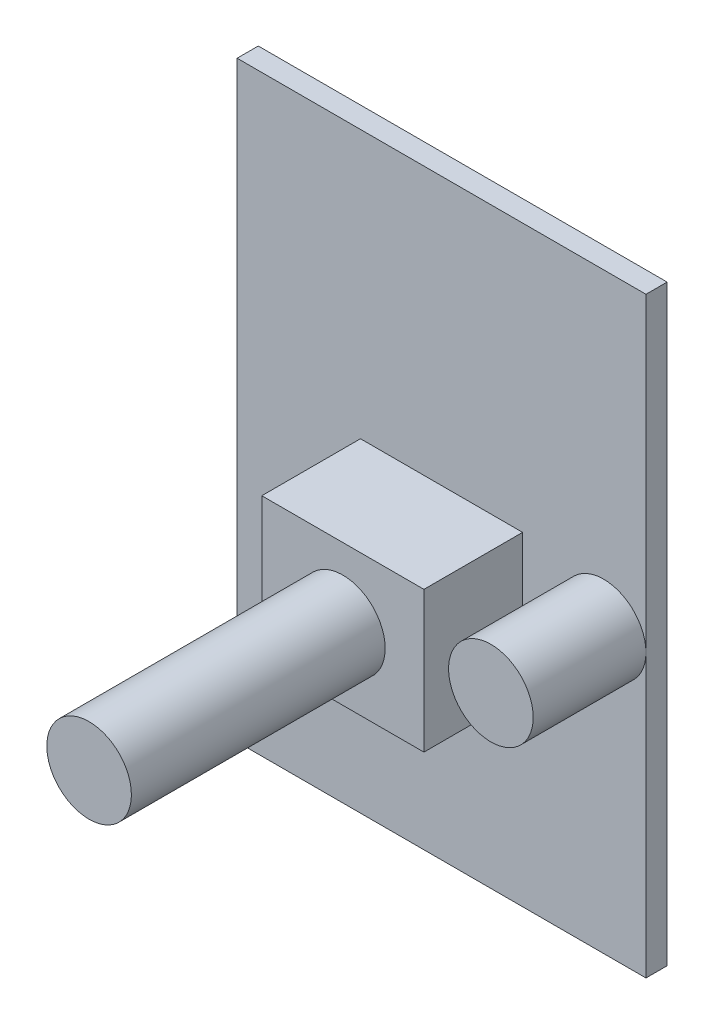
ISO-10303-21;
HEADER;
FILE_DESCRIPTION(('STEP AP214'),'2;1');
FILE_NAME('part.step','',(''),(''),'','','');
FILE_SCHEMA(('AUTOMOTIVE_DESIGN { 1 0 10303 214 1 1 1 1 }'));
ENDSEC;
DATA;
#1=APPLICATION_CONTEXT('core data for automotive mechanical design processes');
#2=APPLICATION_PROTOCOL_DEFINITION('international standard','automotive_design',2000,#1);
#3=PRODUCT_CONTEXT('',#1,'mechanical');
#4=PRODUCT('Part','Part','',(#3));
#5=PRODUCT_RELATED_PRODUCT_CATEGORY('part','',(#4));
#6=PRODUCT_DEFINITION_FORMATION('','',#4);
#7=PRODUCT_DEFINITION_CONTEXT('part definition',#1,'design');
#8=PRODUCT_DEFINITION('design','',#6,#7);
#9=PRODUCT_DEFINITION_SHAPE('','',#8);
#10=(LENGTH_UNIT() NAMED_UNIT(*) SI_UNIT(.MILLI.,.METRE.));
#11=(NAMED_UNIT(*) PLANE_ANGLE_UNIT() SI_UNIT($,.RADIAN.));
#12=(NAMED_UNIT(*) SI_UNIT($,.STERADIAN.) SOLID_ANGLE_UNIT());
#13=UNCERTAINTY_MEASURE_WITH_UNIT(LENGTH_MEASURE(1.E-05),#10,'distance_accuracy_value','');
#14=(GEOMETRIC_REPRESENTATION_CONTEXT(3) GLOBAL_UNCERTAINTY_ASSIGNED_CONTEXT((#13)) GLOBAL_UNIT_ASSIGNED_CONTEXT((#10,
#11,#12)) REPRESENTATION_CONTEXT('',''));
#15=CARTESIAN_POINT('',(0.,0.,0.));
#16=DIRECTION('',(0.,0.,1.));
#17=DIRECTION('',(1.,0.,0.));
#18=AXIS2_PLACEMENT_3D('',#15,#16,#17);
#19=CARTESIAN_POINT('',(0.,0.,1.5));
#20=DIRECTION('',(0.,0.,1.));
#21=DIRECTION('',(1.,0.,0.));
#22=AXIS2_PLACEMENT_3D('',#19,#20,#21);
#23=PLANE('',#22);
#24=DIRECTION('',(0.,1.,0.));
#25=VECTOR('',#24,1.);
#26=CARTESIAN_POINT('',(14.5,21.,1.5));
#27=LINE('',#26,#25);
#28=CARTESIAN_POINT('',(14.5,-21.,1.5));
#29=VERTEX_POINT('',#28);
#30=CARTESIAN_POINT('',(14.5,-0.999999999999994,1.5));
#31=VERTEX_POINT('',#30);
#32=EDGE_CURVE('E133',#29,#31,#27,.T.);
#33=ORIENTED_EDGE('',*,*,#32,.T.);
#34=CARTESIAN_POINT('',(11.5,-1.,1.5));
#35=DIRECTION('',(0.,0.,1.));
#36=DIRECTION('',(1.,0.,0.));
#37=AXIS2_PLACEMENT_3D('',#34,#35,#36);
#38=CIRCLE('',#37,3.);
#39=EDGE_CURVE('E46',#31,#31,#38,.T.);
#40=ORIENTED_EDGE('',*,*,#39,.F.);
#41=CARTESIAN_POINT('',(14.5,21.,1.5));
#42=VERTEX_POINT('',#41);
#43=EDGE_CURVE('E137',#31,#42,#27,.T.);
#44=ORIENTED_EDGE('',*,*,#43,.T.);
#45=DIRECTION('',(-1.,0.,0.));
#46=VECTOR('',#45,1.);
#47=CARTESIAN_POINT('',(-14.5,21.,1.5));
#48=LINE('',#47,#46);
#49=CARTESIAN_POINT('',(-14.5,21.,1.5));
#50=VERTEX_POINT('',#49);
#51=EDGE_CURVE('E136',#42,#50,#48,.T.);
#52=ORIENTED_EDGE('',*,*,#51,.T.);
#53=DIRECTION('',(0.,-1.,0.));
#54=VECTOR('',#53,1.);
#55=CARTESIAN_POINT('',(-14.5,21.,1.5));
#56=LINE('',#55,#54);
#57=CARTESIAN_POINT('',(-14.5,-21.,1.5));
#58=VERTEX_POINT('',#57);
#59=EDGE_CURVE('E139',#50,#58,#56,.T.);
#60=ORIENTED_EDGE('',*,*,#59,.T.);
#61=DIRECTION('',(1.,0.,0.));
#62=VECTOR('',#61,1.);
#63=CARTESIAN_POINT('',(-14.5,-21.,1.5));
#64=LINE('',#63,#62);
#65=EDGE_CURVE('E141',#58,#29,#64,.T.);
#66=ORIENTED_EDGE('',*,*,#65,.T.);
#67=EDGE_LOOP('',(#33,#40,#44,#52,#60,#66));
#68=FACE_BOUND('',#67,.T.);
#69=DIRECTION('',(-1.,0.,0.));
#70=VECTOR('',#69,1.);
#71=CARTESIAN_POINT('',(-5.75,2.,1.5));
#72=LINE('',#71,#70);
#73=CARTESIAN_POINT('',(5.75,2.,1.5));
#74=VERTEX_POINT('',#73);
#75=CARTESIAN_POINT('',(-5.75,2.,1.5));
#76=VERTEX_POINT('',#75);
#77=EDGE_CURVE('E323',#74,#76,#72,.T.);
#78=ORIENTED_EDGE('',*,*,#77,.F.);
#79=DIRECTION('',(0.,1.,0.));
#80=VECTOR('',#79,1.);
#81=CARTESIAN_POINT('',(5.75,2.,1.5));
#82=LINE('',#81,#80);
#83=CARTESIAN_POINT('',(5.75,-8.,1.5));
#84=VERTEX_POINT('',#83);
#85=EDGE_CURVE('E123',#84,#74,#82,.T.);
#86=ORIENTED_EDGE('',*,*,#85,.F.);
#87=DIRECTION('',(1.,0.,0.));
#88=VECTOR('',#87,1.);
#89=CARTESIAN_POINT('',(-5.75,-8.,1.5));
#90=LINE('',#89,#88);
#91=CARTESIAN_POINT('',(-5.75,-8.,1.5));
#92=VERTEX_POINT('',#91);
#93=EDGE_CURVE('E119',#92,#84,#90,.T.);
#94=ORIENTED_EDGE('',*,*,#93,.F.);
#95=DIRECTION('',(0.,-1.,0.));
#96=VECTOR('',#95,1.);
#97=CARTESIAN_POINT('',(-5.75,2.,1.5));
#98=LINE('',#97,#96);
#99=EDGE_CURVE('E325',#76,#92,#98,.T.);
#100=ORIENTED_EDGE('',*,*,#99,.F.);
#101=EDGE_LOOP('',(#78,#86,#94,#100));
#102=FACE_BOUND('',#101,.T.);
#103=ADVANCED_FACE('F33',(#68,#102),#23,.T.);
#104=CARTESIAN_POINT('',(14.5,21.,1.5));
#105=DIRECTION('',(-1.,0.,0.));
#106=DIRECTION('',(0.,-1.,0.));
#107=AXIS2_PLACEMENT_3D('',#104,#105,#106);
#108=PLANE('',#107);
#109=DIRECTION('',(0.,1.,0.));
#110=VECTOR('',#109,1.);
#111=CARTESIAN_POINT('',(14.5,21.,0.));
#112=LINE('',#111,#110);
#113=CARTESIAN_POINT('',(14.5,-21.,0.));
#114=VERTEX_POINT('',#113);
#115=CARTESIAN_POINT('',(14.5,21.,0.));
#116=VERTEX_POINT('',#115);
#117=EDGE_CURVE('E125',#114,#116,#112,.T.);
#118=ORIENTED_EDGE('',*,*,#117,.T.);
#119=DIRECTION('',(0.,0.,-1.));
#120=VECTOR('',#119,1.);
#121=CARTESIAN_POINT('',(14.5,21.,1.5));
#122=LINE('',#121,#120);
#123=EDGE_CURVE('E11',#42,#116,#122,.T.);
#124=ORIENTED_EDGE('',*,*,#123,.F.);
#125=ORIENTED_EDGE('',*,*,#43,.F.);
#126=ORIENTED_EDGE('',*,*,#32,.F.);
#127=DIRECTION('',(0.,0.,-1.));
#128=VECTOR('',#127,1.);
#129=CARTESIAN_POINT('',(14.5,-21.,1.5));
#130=LINE('',#129,#128);
#131=EDGE_CURVE('E142',#29,#114,#130,.T.);
#132=ORIENTED_EDGE('',*,*,#131,.T.);
#133=EDGE_LOOP('',(#118,#124,#125,#126,#132));
#134=FACE_BOUND('',#133,.T.);
#135=ADVANCED_FACE('F35',(#134),#108,.F.);
#136=CARTESIAN_POINT('',(-14.5,21.,1.5));
#137=DIRECTION('',(0.,-1.,0.));
#138=DIRECTION('',(0.,0.,-1.));
#139=AXIS2_PLACEMENT_3D('',#136,#137,#138);
#140=PLANE('',#139);
#141=DIRECTION('',(-1.,0.,0.));
#142=VECTOR('',#141,1.);
#143=CARTESIAN_POINT('',(-14.5,21.,0.));
#144=LINE('',#143,#142);
#145=CARTESIAN_POINT('',(-14.5,21.,0.));
#146=VERTEX_POINT('',#145);
#147=EDGE_CURVE('E128',#116,#146,#144,.T.);
#148=ORIENTED_EDGE('',*,*,#147,.T.);
#149=DIRECTION('',(0.,0.,-1.));
#150=VECTOR('',#149,1.);
#151=CARTESIAN_POINT('',(-14.5,21.,1.5));
#152=LINE('',#151,#150);
#153=EDGE_CURVE('E41',#50,#146,#152,.T.);
#154=ORIENTED_EDGE('',*,*,#153,.F.);
#155=ORIENTED_EDGE('',*,*,#51,.F.);
#156=ORIENTED_EDGE('',*,*,#123,.T.);
#157=EDGE_LOOP('',(#148,#154,#155,#156));
#158=FACE_BOUND('',#157,.T.);
#159=ADVANCED_FACE('F176',(#158),#140,.F.);
#160=CARTESIAN_POINT('',(-14.5,21.,1.5));
#161=DIRECTION('',(1.,0.,0.));
#162=DIRECTION('',(0.,1.,0.));
#163=AXIS2_PLACEMENT_3D('',#160,#161,#162);
#164=PLANE('',#163);
#165=DIRECTION('',(0.,-1.,0.));
#166=VECTOR('',#165,1.);
#167=CARTESIAN_POINT('',(-14.5,21.,0.));
#168=LINE('',#167,#166);
#169=CARTESIAN_POINT('',(-14.5,-21.,0.));
#170=VERTEX_POINT('',#169);
#171=EDGE_CURVE('E145',#146,#170,#168,.T.);
#172=ORIENTED_EDGE('',*,*,#171,.T.);
#173=DIRECTION('',(0.,0.,-1.));
#174=VECTOR('',#173,1.);
#175=CARTESIAN_POINT('',(-14.5,-21.,1.5));
#176=LINE('',#175,#174);
#177=EDGE_CURVE('E151',#58,#170,#176,.T.);
#178=ORIENTED_EDGE('',*,*,#177,.F.);
#179=ORIENTED_EDGE('',*,*,#59,.F.);
#180=ORIENTED_EDGE('',*,*,#153,.T.);
#181=EDGE_LOOP('',(#172,#178,#179,#180));
#182=FACE_BOUND('',#181,.T.);
#183=ADVANCED_FACE('F158',(#182),#164,.F.);
#184=CARTESIAN_POINT('',(-14.5,-21.,1.5));
#185=DIRECTION('',(0.,1.,0.));
#186=DIRECTION('',(0.,0.,1.));
#187=AXIS2_PLACEMENT_3D('',#184,#185,#186);
#188=PLANE('',#187);
#189=DIRECTION('',(1.,0.,0.));
#190=VECTOR('',#189,1.);
#191=CARTESIAN_POINT('',(-14.5,-21.,0.));
#192=LINE('',#191,#190);
#193=EDGE_CURVE('E147',#170,#114,#192,.T.);
#194=ORIENTED_EDGE('',*,*,#193,.T.);
#195=ORIENTED_EDGE('',*,*,#131,.F.);
#196=ORIENTED_EDGE('',*,*,#65,.F.);
#197=ORIENTED_EDGE('',*,*,#177,.T.);
#198=EDGE_LOOP('',(#194,#195,#196,#197));
#199=FACE_BOUND('',#198,.T.);
#200=ADVANCED_FACE('F168',(#199),#188,.F.);
#201=CARTESIAN_POINT('',(0.,0.,0.));
#202=DIRECTION('',(0.,0.,1.));
#203=DIRECTION('',(1.,0.,0.));
#204=AXIS2_PLACEMENT_3D('',#201,#202,#203);
#205=PLANE('',#204);
#206=ORIENTED_EDGE('',*,*,#117,.F.);
#207=ORIENTED_EDGE('',*,*,#193,.F.);
#208=ORIENTED_EDGE('',*,*,#171,.F.);
#209=ORIENTED_EDGE('',*,*,#147,.F.);
#210=EDGE_LOOP('',(#206,#207,#208,#209));
#211=FACE_BOUND('',#210,.T.);
#212=ADVANCED_FACE('F165',(#211),#205,.F.);
#213=CARTESIAN_POINT('',(5.75,2.,8.5));
#214=DIRECTION('',(-1.,0.,0.));
#215=DIRECTION('',(0.,-1.,0.));
#216=AXIS2_PLACEMENT_3D('',#213,#214,#215);
#217=PLANE('',#216);
#218=ORIENTED_EDGE('',*,*,#85,.T.);
#219=DIRECTION('',(0.,0.,-1.));
#220=VECTOR('',#219,1.);
#221=CARTESIAN_POINT('',(5.75,2.,8.5));
#222=LINE('',#221,#220);
#223=CARTESIAN_POINT('',(5.75,2.,8.5));
#224=VERTEX_POINT('',#223);
#225=EDGE_CURVE('E104',#224,#74,#222,.T.);
#226=ORIENTED_EDGE('',*,*,#225,.F.);
#227=DIRECTION('',(0.,1.,0.));
#228=VECTOR('',#227,1.);
#229=CARTESIAN_POINT('',(5.75,2.,8.5));
#230=LINE('',#229,#228);
#231=CARTESIAN_POINT('',(5.75,-8.,8.5));
#232=VERTEX_POINT('',#231);
#233=EDGE_CURVE('E111',#232,#224,#230,.T.);
#234=ORIENTED_EDGE('',*,*,#233,.F.);
#235=DIRECTION('',(0.,0.,-1.));
#236=VECTOR('',#235,1.);
#237=CARTESIAN_POINT('',(5.75,-8.,8.5));
#238=LINE('',#237,#236);
#239=EDGE_CURVE('E321',#232,#84,#238,.T.);
#240=ORIENTED_EDGE('',*,*,#239,.T.);
#241=EDGE_LOOP('',(#218,#226,#234,#240));
#242=FACE_BOUND('',#241,.T.);
#243=ADVANCED_FACE('F121',(#242),#217,.F.);
#244=CARTESIAN_POINT('',(-5.75,2.,8.5));
#245=DIRECTION('',(0.,-1.,0.));
#246=DIRECTION('',(0.,0.,-1.));
#247=AXIS2_PLACEMENT_3D('',#244,#245,#246);
#248=PLANE('',#247);
#249=ORIENTED_EDGE('',*,*,#77,.T.);
#250=DIRECTION('',(0.,0.,-1.));
#251=VECTOR('',#250,1.);
#252=CARTESIAN_POINT('',(-5.75,2.,8.5));
#253=LINE('',#252,#251);
#254=CARTESIAN_POINT('',(-5.75,2.,8.5));
#255=VERTEX_POINT('',#254);
#256=EDGE_CURVE('E107',#255,#76,#253,.T.);
#257=ORIENTED_EDGE('',*,*,#256,.F.);
#258=DIRECTION('',(-1.,0.,0.));
#259=VECTOR('',#258,1.);
#260=CARTESIAN_POINT('',(-5.75,2.,8.5));
#261=LINE('',#260,#259);
#262=EDGE_CURVE('E100',#224,#255,#261,.T.);
#263=ORIENTED_EDGE('',*,*,#262,.F.);
#264=ORIENTED_EDGE('',*,*,#225,.T.);
#265=EDGE_LOOP('',(#249,#257,#263,#264));
#266=FACE_BOUND('',#265,.T.);
#267=ADVANCED_FACE('F102',(#266),#248,.F.);
#268=CARTESIAN_POINT('',(-5.75,2.,8.5));
#269=DIRECTION('',(1.,0.,0.));
#270=DIRECTION('',(0.,1.,0.));
#271=AXIS2_PLACEMENT_3D('',#268,#269,#270);
#272=PLANE('',#271);
#273=ORIENTED_EDGE('',*,*,#99,.T.);
#274=DIRECTION('',(0.,0.,-1.));
#275=VECTOR('',#274,1.);
#276=CARTESIAN_POINT('',(-5.75,-8.,8.5));
#277=LINE('',#276,#275);
#278=CARTESIAN_POINT('',(-5.75,-8.,8.5));
#279=VERTEX_POINT('',#278);
#280=EDGE_CURVE('E53',#279,#92,#277,.T.);
#281=ORIENTED_EDGE('',*,*,#280,.F.);
#282=DIRECTION('',(0.,-1.,0.));
#283=VECTOR('',#282,1.);
#284=CARTESIAN_POINT('',(-5.75,2.,8.5));
#285=LINE('',#284,#283);
#286=EDGE_CURVE('E110',#255,#279,#285,.T.);
#287=ORIENTED_EDGE('',*,*,#286,.F.);
#288=ORIENTED_EDGE('',*,*,#256,.T.);
#289=EDGE_LOOP('',(#273,#281,#287,#288));
#290=FACE_BOUND('',#289,.T.);
#291=ADVANCED_FACE('F212',(#290),#272,.F.);
#292=CARTESIAN_POINT('',(-5.75,-8.,8.5));
#293=DIRECTION('',(0.,1.,0.));
#294=DIRECTION('',(0.,0.,1.));
#295=AXIS2_PLACEMENT_3D('',#292,#293,#294);
#296=PLANE('',#295);
#297=ORIENTED_EDGE('',*,*,#93,.T.);
#298=ORIENTED_EDGE('',*,*,#239,.F.);
#299=DIRECTION('',(1.,0.,0.));
#300=VECTOR('',#299,1.);
#301=CARTESIAN_POINT('',(-5.75,-8.,8.5));
#302=LINE('',#301,#300);
#303=EDGE_CURVE('E115',#279,#232,#302,.T.);
#304=ORIENTED_EDGE('',*,*,#303,.F.);
#305=ORIENTED_EDGE('',*,*,#280,.T.);
#306=EDGE_LOOP('',(#297,#298,#304,#305));
#307=FACE_BOUND('',#306,.T.);
#308=ADVANCED_FACE('F218',(#307),#296,.F.);
#309=CARTESIAN_POINT('',(0.,0.,8.5));
#310=DIRECTION('',(0.,0.,1.));
#311=DIRECTION('',(1.,0.,0.));
#312=AXIS2_PLACEMENT_3D('',#309,#310,#311);
#313=PLANE('',#312);
#314=CARTESIAN_POINT('',(0.,-3.,8.5));
#315=DIRECTION('',(0.,0.,1.));
#316=DIRECTION('',(1.,0.,0.));
#317=AXIS2_PLACEMENT_3D('',#314,#315,#316);
#318=CIRCLE('',#317,3.);
#319=CARTESIAN_POINT('',(3.,-3.,8.5));
#320=VERTEX_POINT('',#319);
#321=EDGE_CURVE('E310',#320,#320,#318,.T.);
#322=ORIENTED_EDGE('',*,*,#321,.F.);
#323=EDGE_LOOP('',(#322));
#324=FACE_BOUND('',#323,.T.);
#325=ORIENTED_EDGE('',*,*,#233,.T.);
#326=ORIENTED_EDGE('',*,*,#262,.T.);
#327=ORIENTED_EDGE('',*,*,#286,.T.);
#328=ORIENTED_EDGE('',*,*,#303,.T.);
#329=EDGE_LOOP('',(#325,#326,#327,#328));
#330=FACE_BOUND('',#329,.T.);
#331=ADVANCED_FACE('F114',(#324,#330),#313,.T.);
#332=CARTESIAN_POINT('',(0.,-3.,26.5));
#333=DIRECTION('',(0.,0.,-1.));
#334=DIRECTION('',(-1.,0.,0.));
#335=AXIS2_PLACEMENT_3D('',#332,#333,#334);
#336=CYLINDRICAL_SURFACE('',#335,3.);
#337=CARTESIAN_POINT('',(0.,-3.,26.5));
#338=DIRECTION('',(0.,0.,1.));
#339=DIRECTION('',(1.,0.,0.));
#340=AXIS2_PLACEMENT_3D('',#337,#338,#339);
#341=CIRCLE('',#340,3.);
#342=CARTESIAN_POINT('',(3.,-3.,26.5));
#343=VERTEX_POINT('',#342);
#344=EDGE_CURVE('E313',#343,#343,#341,.T.);
#345=ORIENTED_EDGE('',*,*,#344,.F.);
#346=EDGE_LOOP('',(#345));
#347=FACE_BOUND('',#346,.T.);
#348=ORIENTED_EDGE('',*,*,#321,.T.);
#349=EDGE_LOOP('',(#348));
#350=FACE_BOUND('',#349,.T.);
#351=ADVANCED_FACE('F232',(#347,#350),#336,.T.);
#352=CARTESIAN_POINT('',(0.,-3.,26.5));
#353=DIRECTION('',(0.,0.,1.));
#354=DIRECTION('',(1.,0.,0.));
#355=AXIS2_PLACEMENT_3D('',#352,#353,#354);
#356=PLANE('',#355);
#357=ORIENTED_EDGE('',*,*,#344,.T.);
#358=EDGE_LOOP('',(#357));
#359=FACE_BOUND('',#358,.T.);
#360=ADVANCED_FACE('F240',(#359),#356,.T.);
#361=CARTESIAN_POINT('',(11.5,-1.,9.5));
#362=DIRECTION('',(0.,0.,-1.));
#363=DIRECTION('',(-1.,0.,0.));
#364=AXIS2_PLACEMENT_3D('',#361,#362,#363);
#365=CYLINDRICAL_SURFACE('',#364,3.);
#366=CARTESIAN_POINT('',(11.5,-1.,9.5));
#367=DIRECTION('',(0.,0.,1.));
#368=DIRECTION('',(1.,0.,0.));
#369=AXIS2_PLACEMENT_3D('',#366,#367,#368);
#370=CIRCLE('',#369,3.);
#371=CARTESIAN_POINT('',(14.5,-1.,9.5));
#372=VERTEX_POINT('',#371);
#373=EDGE_CURVE('E309',#372,#372,#370,.T.);
#374=ORIENTED_EDGE('',*,*,#373,.F.);
#375=EDGE_LOOP('',(#374));
#376=FACE_BOUND('',#375,.T.);
#377=ORIENTED_EDGE('',*,*,#39,.T.);
#378=EDGE_LOOP('',(#377));
#379=FACE_BOUND('',#378,.T.);
#380=ADVANCED_FACE('F248',(#376,#379),#365,.T.);
#381=CARTESIAN_POINT('',(11.5,-1.,9.5));
#382=DIRECTION('',(0.,0.,1.));
#383=DIRECTION('',(1.,0.,0.));
#384=AXIS2_PLACEMENT_3D('',#381,#382,#383);
#385=PLANE('',#384);
#386=ORIENTED_EDGE('',*,*,#373,.T.);
#387=EDGE_LOOP('',(#386));
#388=FACE_BOUND('',#387,.T.);
#389=ADVANCED_FACE('F256',(#388),#385,.T.);
#390=CLOSED_SHELL('',(#103,#135,#159,#183,#200,#212,#243,#267,#291,#308,#331,#351,#360,#380,#389));
#391=MANIFOLD_SOLID_BREP('B2',#390);
#392=ADVANCED_BREP_SHAPE_REPRESENTATION('',(#18,#391),#14);
#393=SHAPE_DEFINITION_REPRESENTATION(#9,#392);
ENDSEC;
END-ISO-10303-21;
